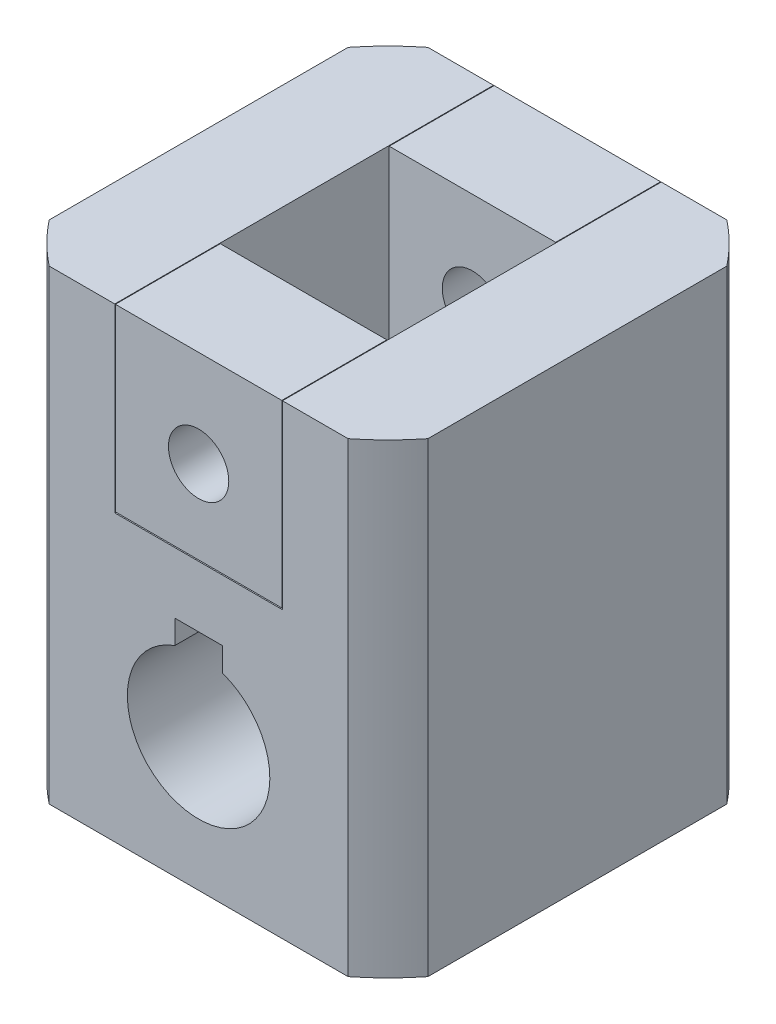
ISO-10303-21;
HEADER;
FILE_DESCRIPTION(('STEP AP214'),'2;1');
FILE_NAME('part.step','',(''),(''),'','','');
FILE_SCHEMA(('AUTOMOTIVE_DESIGN { 1 0 10303 214 1 1 1 1 }'));
ENDSEC;
DATA;
#1=APPLICATION_CONTEXT('core data for automotive mechanical design processes');
#2=APPLICATION_PROTOCOL_DEFINITION('international standard','automotive_design',2000,#1);
#3=PRODUCT_CONTEXT('',#1,'mechanical');
#4=PRODUCT('Part','Part','',(#3));
#5=PRODUCT_RELATED_PRODUCT_CATEGORY('part','',(#4));
#6=PRODUCT_DEFINITION_FORMATION('','',#4);
#7=PRODUCT_DEFINITION_CONTEXT('part definition',#1,'design');
#8=PRODUCT_DEFINITION('design','',#6,#7);
#9=PRODUCT_DEFINITION_SHAPE('','',#8);
#10=(LENGTH_UNIT() NAMED_UNIT(*) SI_UNIT(.MILLI.,.METRE.));
#11=(NAMED_UNIT(*) PLANE_ANGLE_UNIT() SI_UNIT($,.RADIAN.));
#12=(NAMED_UNIT(*) SI_UNIT($,.STERADIAN.) SOLID_ANGLE_UNIT());
#13=UNCERTAINTY_MEASURE_WITH_UNIT(LENGTH_MEASURE(1.E-05),#10,'distance_accuracy_value','');
#14=(GEOMETRIC_REPRESENTATION_CONTEXT(3) GLOBAL_UNCERTAINTY_ASSIGNED_CONTEXT((#13)) GLOBAL_UNIT_ASSIGNED_CONTEXT((#10,
#11,#12)) REPRESENTATION_CONTEXT('',''));
#15=CARTESIAN_POINT('',(0.,0.,0.));
#16=DIRECTION('',(0.,0.,1.));
#17=DIRECTION('',(1.,0.,0.));
#18=AXIS2_PLACEMENT_3D('',#15,#16,#17);
#19=CARTESIAN_POINT('',(0.,30.127,0.));
#20=DIRECTION('',(0.,-1.,0.));
#21=DIRECTION('',(0.,0.,-1.));
#22=AXIS2_PLACEMENT_3D('',#19,#20,#21);
#23=PLANE('',#22);
#24=DIRECTION('',(0.,0.,-1.));
#25=VECTOR('',#24,1.);
#26=CARTESIAN_POINT('',(8.76300000000005,30.127,-19.9389999999999));
#27=LINE('',#26,#25);
#28=CARTESIAN_POINT('',(8.76300000000005,30.127,-8.89000000000006));
#29=VERTEX_POINT('',#28);
#30=CARTESIAN_POINT('',(8.76300000000005,30.127,-19.9389999999999));
#31=VERTEX_POINT('',#30);
#32=EDGE_CURVE('E79',#29,#31,#27,.T.);
#33=ORIENTED_EDGE('',*,*,#32,.F.);
#34=DIRECTION('',(1.,0.,0.));
#35=VECTOR('',#34,1.);
#36=CARTESIAN_POINT('',(8.76300000000005,30.127,-8.89000000000006));
#37=LINE('',#36,#35);
#38=CARTESIAN_POINT('',(-8.76299999999997,30.127,-8.89000000000001));
#39=VERTEX_POINT('',#38);
#40=EDGE_CURVE('E104',#39,#29,#37,.T.);
#41=ORIENTED_EDGE('',*,*,#40,.F.);
#42=DIRECTION('',(0.,0.,1.));
#43=VECTOR('',#42,1.);
#44=CARTESIAN_POINT('',(-8.76299999999997,30.127,-8.89000000000001));
#45=LINE('',#44,#43);
#46=CARTESIAN_POINT('',(-8.76299999999988,30.127,-19.9390000000001));
#47=VERTEX_POINT('',#46);
#48=EDGE_CURVE('E134',#47,#39,#45,.T.);
#49=ORIENTED_EDGE('',*,*,#48,.F.);
#50=DIRECTION('',(-1.,0.,0.));
#51=VECTOR('',#50,1.);
#52=CARTESIAN_POINT('',(-8.76299999999988,30.127,-19.9390000000001));
#53=LINE('',#52,#51);
#54=EDGE_CURVE('E118',#31,#47,#53,.T.);
#55=ORIENTED_EDGE('',*,*,#54,.F.);
#56=EDGE_LOOP('',(#33,#41,#49,#55));
#57=FACE_BOUND('',#56,.T.);
#58=ADVANCED_FACE('F59',(#57),#23,.T.);
#59=CARTESIAN_POINT('',(0.,49.05,0.));
#60=DIRECTION('',(0.,-1.,0.));
#61=DIRECTION('',(0.,0.,-1.));
#62=AXIS2_PLACEMENT_3D('',#59,#60,#61);
#63=PLANE('',#62);
#64=DIRECTION('',(0.,0.,-1.));
#65=VECTOR('',#64,1.);
#66=CARTESIAN_POINT('',(8.76299999999997,49.05,-19.939));
#67=LINE('',#66,#65);
#68=CARTESIAN_POINT('',(8.76299999999994,49.05,-8.89000000000001));
#69=VERTEX_POINT('',#68);
#70=CARTESIAN_POINT('',(8.76299999999997,49.05,-19.939));
#71=VERTEX_POINT('',#70);
#72=EDGE_CURVE('E13',#69,#71,#67,.T.);
#73=ORIENTED_EDGE('',*,*,#72,.T.);
#74=DIRECTION('',(-1.,0.,0.));
#75=VECTOR('',#74,1.);
#76=CARTESIAN_POINT('',(-8.76299999999988,49.05,-19.9389999999999));
#77=LINE('',#76,#75);
#78=CARTESIAN_POINT('',(-8.76299999999988,49.05,-19.9389999999999));
#79=VERTEX_POINT('',#78);
#80=EDGE_CURVE('E70',#71,#79,#77,.T.);
#81=ORIENTED_EDGE('',*,*,#80,.T.);
#82=DIRECTION('',(0.,0.,1.));
#83=VECTOR('',#82,1.);
#84=CARTESIAN_POINT('',(-8.76299999999991,49.0500000000001,-8.89000000000004));
#85=LINE('',#84,#83);
#86=CARTESIAN_POINT('',(-8.76299999999991,49.0500000000001,-8.89000000000004));
#87=VERTEX_POINT('',#86);
#88=EDGE_CURVE('E116',#79,#87,#85,.T.);
#89=ORIENTED_EDGE('',*,*,#88,.T.);
#90=DIRECTION('',(1.,0.,0.));
#91=VECTOR('',#90,1.);
#92=CARTESIAN_POINT('',(8.76299999999994,49.05,-8.89000000000001));
#93=LINE('',#92,#91);
#94=EDGE_CURVE('E103',#87,#69,#93,.T.);
#95=ORIENTED_EDGE('',*,*,#94,.T.);
#96=EDGE_LOOP('',(#73,#81,#89,#95));
#97=FACE_BOUND('',#96,.T.);
#98=ADVANCED_FACE('F61',(#97),#63,.F.);
#99=CARTESIAN_POINT('',(-8.76299999999991,9.28186598653247,-19.9390000000001));
#100=DIRECTION('',(0.,0.,-1.));
#101=DIRECTION('',(0.,1.,0.));
#102=AXIS2_PLACEMENT_3D('',#99,#100,#101);
#103=PLANE('',#102);
#104=CARTESIAN_POINT('',(0.,38.89,-19.939));
#105=DIRECTION('',(0.,0.,1.));
#106=DIRECTION('',(1.,0.,0.));
#107=AXIS2_PLACEMENT_3D('',#104,#105,#106);
#108=CIRCLE('',#107,3.175);
#109=CARTESIAN_POINT('',(3.17500000000008,38.89,-19.939));
#110=VERTEX_POINT('',#109);
#111=EDGE_CURVE('E144',#110,#110,#108,.T.);
#112=ORIENTED_EDGE('',*,*,#111,.T.);
#113=EDGE_LOOP('',(#112));
#114=FACE_BOUND('',#113,.T.);
#115=DIRECTION('',(0.,1.,0.));
#116=VECTOR('',#115,1.);
#117=CARTESIAN_POINT('',(8.76299999999999,9.28186598653247,-19.9389999999999));
#118=LINE('',#117,#116);
#119=EDGE_CURVE('E110',#31,#71,#118,.T.);
#120=ORIENTED_EDGE('',*,*,#119,.F.);
#121=ORIENTED_EDGE('',*,*,#54,.T.);
#122=DIRECTION('',(0.,1.,0.));
#123=VECTOR('',#122,1.);
#124=CARTESIAN_POINT('',(-8.76299999999991,9.28186598653247,-19.9390000000001));
#125=LINE('',#124,#123);
#126=EDGE_CURVE('E124',#47,#79,#125,.T.);
#127=ORIENTED_EDGE('',*,*,#126,.T.);
#128=ORIENTED_EDGE('',*,*,#80,.F.);
#129=EDGE_LOOP('',(#120,#121,#127,#128));
#130=FACE_BOUND('',#129,.T.);
#131=ADVANCED_FACE('F165',(#114,#130),#103,.T.);
#132=CARTESIAN_POINT('',(-8.76299999999997,9.28186598653258,-8.88999999999998));
#133=DIRECTION('',(-1.,0.,0.));
#134=DIRECTION('',(0.,0.,1.));
#135=AXIS2_PLACEMENT_3D('',#132,#133,#134);
#136=PLANE('',#135);
#137=ORIENTED_EDGE('',*,*,#126,.F.);
#138=ORIENTED_EDGE('',*,*,#48,.T.);
#139=DIRECTION('',(0.,1.,0.));
#140=VECTOR('',#139,1.);
#141=CARTESIAN_POINT('',(-8.76299999999997,9.28186598653258,-8.88999999999998));
#142=LINE('',#141,#140);
#143=EDGE_CURVE('E133',#39,#87,#142,.T.);
#144=ORIENTED_EDGE('',*,*,#143,.T.);
#145=ORIENTED_EDGE('',*,*,#88,.F.);
#146=EDGE_LOOP('',(#137,#138,#144,#145));
#147=FACE_BOUND('',#146,.T.);
#148=ADVANCED_FACE('F159',(#147),#136,.T.);
#149=CARTESIAN_POINT('',(8.76300000000005,9.28186598653247,-8.89000000000004));
#150=DIRECTION('',(0.,0.,1.));
#151=DIRECTION('',(0.,-1.,0.));
#152=AXIS2_PLACEMENT_3D('',#149,#150,#151);
#153=PLANE('',#152);
#154=CARTESIAN_POINT('',(0.,38.89,-8.89000000000004));
#155=DIRECTION('',(0.,0.,1.));
#156=DIRECTION('',(0.,-1.,0.));
#157=AXIS2_PLACEMENT_3D('',#154,#155,#156);
#158=CIRCLE('',#157,3.175);
#159=CARTESIAN_POINT('',(0.,35.715,-8.89000000000004));
#160=VERTEX_POINT('',#159);
#161=EDGE_CURVE('E63',#160,#160,#158,.T.);
#162=ORIENTED_EDGE('',*,*,#161,.F.);
#163=EDGE_LOOP('',(#162));
#164=FACE_BOUND('',#163,.T.);
#165=ORIENTED_EDGE('',*,*,#143,.F.);
#166=ORIENTED_EDGE('',*,*,#40,.T.);
#167=DIRECTION('',(0.,1.,0.));
#168=VECTOR('',#167,1.);
#169=CARTESIAN_POINT('',(8.76300000000005,9.28186598653247,-8.89000000000004));
#170=LINE('',#169,#168);
#171=EDGE_CURVE('E98',#29,#69,#170,.T.);
#172=ORIENTED_EDGE('',*,*,#171,.T.);
#173=ORIENTED_EDGE('',*,*,#94,.F.);
#174=EDGE_LOOP('',(#165,#166,#172,#173));
#175=FACE_BOUND('',#174,.T.);
#176=ADVANCED_FACE('F101',(#164,#175),#153,.T.);
#177=CARTESIAN_POINT('',(8.76299999999999,9.28186598653247,-19.9389999999999));
#178=DIRECTION('',(1.,0.,0.));
#179=DIRECTION('',(0.,0.,-1.));
#180=AXIS2_PLACEMENT_3D('',#177,#178,#179);
#181=PLANE('',#180);
#182=ORIENTED_EDGE('',*,*,#171,.F.);
#183=ORIENTED_EDGE('',*,*,#32,.T.);
#184=ORIENTED_EDGE('',*,*,#119,.T.);
#185=ORIENTED_EDGE('',*,*,#72,.F.);
#186=EDGE_LOOP('',(#182,#183,#184,#185));
#187=FACE_BOUND('',#186,.T.);
#188=ADVANCED_FACE('F108',(#187),#181,.T.);
#189=CARTESIAN_POINT('',(0.,38.89,-19.939));
#190=DIRECTION('',(0.,0.,1.));
#191=DIRECTION('',(1.,0.,0.));
#192=AXIS2_PLACEMENT_3D('',#189,#190,#191);
#193=CYLINDRICAL_SURFACE('',#192,3.175);
#194=ORIENTED_EDGE('',*,*,#161,.T.);
#195=EDGE_LOOP('',(#194));
#196=FACE_BOUND('',#195,.T.);
#197=ORIENTED_EDGE('',*,*,#111,.F.);
#198=EDGE_LOOP('',(#197));
#199=FACE_BOUND('',#198,.T.);
#200=ADVANCED_FACE('F155',(#196,#199),#193,.F.);
#201=CLOSED_SHELL('',(#58,#98,#131,#148,#176,#188,#200));
#202=MANIFOLD_SOLID_BREP('B2',#201);
#203=CARTESIAN_POINT('',(0.,30.127,0.));
#204=DIRECTION('',(0.,-1.,0.));
#205=DIRECTION('',(0.,0.,-1.));
#206=AXIS2_PLACEMENT_3D('',#203,#204,#205);
#207=PLANE('',#206);
#208=DIRECTION('',(0.,0.,1.));
#209=VECTOR('',#208,1.);
#210=CARTESIAN_POINT('',(-8.76299999999997,30.127,8.89000000000001));
#211=LINE('',#210,#209);
#212=CARTESIAN_POINT('',(-8.76299999999997,30.127,8.89000000000001));
#213=VERTEX_POINT('',#212);
#214=CARTESIAN_POINT('',(-8.76299999999988,30.127,19.939));
#215=VERTEX_POINT('',#214);
#216=EDGE_CURVE('E252',#213,#215,#211,.T.);
#217=ORIENTED_EDGE('',*,*,#216,.F.);
#218=DIRECTION('',(-1.,0.,0.));
#219=VECTOR('',#218,1.);
#220=CARTESIAN_POINT('',(8.76300000000002,30.127,8.88999999999995));
#221=LINE('',#220,#219);
#222=CARTESIAN_POINT('',(8.76300000000002,30.127,8.88999999999995));
#223=VERTEX_POINT('',#222);
#224=EDGE_CURVE('E275',#223,#213,#221,.T.);
#225=ORIENTED_EDGE('',*,*,#224,.F.);
#226=DIRECTION('',(0.,0.,-1.));
#227=VECTOR('',#226,1.);
#228=CARTESIAN_POINT('',(8.76300000000002,30.127,19.939));
#229=LINE('',#228,#227);
#230=CARTESIAN_POINT('',(8.76300000000002,30.127,19.939));
#231=VERTEX_POINT('',#230);
#232=EDGE_CURVE('E280',#231,#223,#229,.T.);
#233=ORIENTED_EDGE('',*,*,#232,.F.);
#234=DIRECTION('',(1.,0.,0.));
#235=VECTOR('',#234,1.);
#236=CARTESIAN_POINT('',(-8.76299999999988,30.127,19.939));
#237=LINE('',#236,#235);
#238=EDGE_CURVE('E295',#215,#231,#237,.T.);
#239=ORIENTED_EDGE('',*,*,#238,.F.);
#240=EDGE_LOOP('',(#217,#225,#233,#239));
#241=FACE_BOUND('',#240,.T.);
#242=ADVANCED_FACE('F242',(#241),#207,.T.);
#243=CARTESIAN_POINT('',(0.,49.05,0.));
#244=DIRECTION('',(0.,1.,0.));
#245=DIRECTION('',(0.,0.,1.));
#246=AXIS2_PLACEMENT_3D('',#243,#244,#245);
#247=PLANE('',#246);
#248=DIRECTION('',(0.,0.,1.));
#249=VECTOR('',#248,1.);
#250=CARTESIAN_POINT('',(-8.76299999999999,49.0500000000001,8.88999999999995));
#251=LINE('',#250,#249);
#252=CARTESIAN_POINT('',(-8.76299999999999,49.0500000000001,8.88999999999995));
#253=VERTEX_POINT('',#252);
#254=CARTESIAN_POINT('',(-8.76299999999999,49.05,19.939));
#255=VERTEX_POINT('',#254);
#256=EDGE_CURVE('E307',#253,#255,#251,.T.);
#257=ORIENTED_EDGE('',*,*,#256,.T.);
#258=DIRECTION('',(1.,0.,0.));
#259=VECTOR('',#258,1.);
#260=CARTESIAN_POINT('',(-8.76299999999999,49.05,19.939));
#261=LINE('',#260,#259);
#262=CARTESIAN_POINT('',(8.76300000000008,49.05,19.939));
#263=VERTEX_POINT('',#262);
#264=EDGE_CURVE('E293',#255,#263,#261,.T.);
#265=ORIENTED_EDGE('',*,*,#264,.T.);
#266=DIRECTION('',(0.,0.,-1.));
#267=VECTOR('',#266,1.);
#268=CARTESIAN_POINT('',(8.76300000000008,49.05,19.939));
#269=LINE('',#268,#267);
#270=CARTESIAN_POINT('',(8.76299999999999,49.0500000000001,8.88999999999998));
#271=VERTEX_POINT('',#270);
#272=EDGE_CURVE('E298',#263,#271,#269,.T.);
#273=ORIENTED_EDGE('',*,*,#272,.T.);
#274=DIRECTION('',(-1.,0.,0.));
#275=VECTOR('',#274,1.);
#276=CARTESIAN_POINT('',(8.76299999999999,49.0500000000001,8.88999999999998));
#277=LINE('',#276,#275);
#278=EDGE_CURVE('E304',#271,#253,#277,.T.);
#279=ORIENTED_EDGE('',*,*,#278,.T.);
#280=EDGE_LOOP('',(#257,#265,#273,#279));
#281=FACE_BOUND('',#280,.T.);
#282=ADVANCED_FACE('F306',(#281),#247,.T.);
#283=CARTESIAN_POINT('',(-8.76299999999997,9.28186598653258,19.939));
#284=DIRECTION('',(0.,0.,1.));
#285=DIRECTION('',(0.,-1.,0.));
#286=AXIS2_PLACEMENT_3D('',#283,#284,#285);
#287=PLANE('',#286);
#288=CARTESIAN_POINT('',(1.11022302462516E-13,38.89,19.939));
#289=DIRECTION('',(0.,0.,1.));
#290=DIRECTION('',(1.,0.,0.));
#291=AXIS2_PLACEMENT_3D('',#288,#289,#290);
#292=CIRCLE('',#291,3.175);
#293=CARTESIAN_POINT('',(3.17500000000011,38.89,19.939));
#294=VERTEX_POINT('',#293);
#295=EDGE_CURVE('E336',#294,#294,#292,.T.);
#296=ORIENTED_EDGE('',*,*,#295,.F.);
#297=EDGE_LOOP('',(#296));
#298=FACE_BOUND('',#297,.T.);
#299=DIRECTION('',(0.,1.,0.));
#300=VECTOR('',#299,1.);
#301=CARTESIAN_POINT('',(-8.76299999999997,9.28186598653258,19.939));
#302=LINE('',#301,#300);
#303=EDGE_CURVE('E57',#215,#255,#302,.T.);
#304=ORIENTED_EDGE('',*,*,#303,.F.);
#305=ORIENTED_EDGE('',*,*,#238,.T.);
#306=DIRECTION('',(0.,1.,0.));
#307=VECTOR('',#306,1.);
#308=CARTESIAN_POINT('',(8.7630000000001,9.28186598653252,19.939));
#309=LINE('',#308,#307);
#310=EDGE_CURVE('E290',#231,#263,#309,.T.);
#311=ORIENTED_EDGE('',*,*,#310,.T.);
#312=ORIENTED_EDGE('',*,*,#264,.F.);
#313=EDGE_LOOP('',(#304,#305,#311,#312));
#314=FACE_BOUND('',#313,.T.);
#315=ADVANCED_FACE('F291',(#298,#314),#287,.T.);
#316=CARTESIAN_POINT('',(8.7630000000001,9.28186598653252,19.939));
#317=DIRECTION('',(1.,0.,0.));
#318=DIRECTION('',(0.,0.,-1.));
#319=AXIS2_PLACEMENT_3D('',#316,#317,#318);
#320=PLANE('',#319);
#321=ORIENTED_EDGE('',*,*,#310,.F.);
#322=ORIENTED_EDGE('',*,*,#232,.T.);
#323=DIRECTION('',(0.,1.,0.));
#324=VECTOR('',#323,1.);
#325=CARTESIAN_POINT('',(8.76300000000005,9.28186598653263,8.88999999999995));
#326=LINE('',#325,#324);
#327=EDGE_CURVE('E285',#223,#271,#326,.T.);
#328=ORIENTED_EDGE('',*,*,#327,.T.);
#329=ORIENTED_EDGE('',*,*,#272,.F.);
#330=EDGE_LOOP('',(#321,#322,#328,#329));
#331=FACE_BOUND('',#330,.T.);
#332=ADVANCED_FACE('F299',(#331),#320,.T.);
#333=CARTESIAN_POINT('',(8.76300000000005,9.28186598653263,8.88999999999995));
#334=DIRECTION('',(0.,0.,-1.));
#335=DIRECTION('',(0.,1.,0.));
#336=AXIS2_PLACEMENT_3D('',#333,#334,#335);
#337=PLANE('',#336);
#338=CARTESIAN_POINT('',(0.,38.8900000000001,8.88999999999995));
#339=DIRECTION('',(0.,0.,-1.));
#340=DIRECTION('',(0.,1.,0.));
#341=AXIS2_PLACEMENT_3D('',#338,#339,#340);
#342=CIRCLE('',#341,3.175);
#343=CARTESIAN_POINT('',(0.,42.0650000000001,8.88999999999995));
#344=VERTEX_POINT('',#343);
#345=EDGE_CURVE('E245',#344,#344,#342,.T.);
#346=ORIENTED_EDGE('',*,*,#345,.F.);
#347=EDGE_LOOP('',(#346));
#348=FACE_BOUND('',#347,.T.);
#349=ORIENTED_EDGE('',*,*,#327,.F.);
#350=ORIENTED_EDGE('',*,*,#224,.T.);
#351=DIRECTION('',(0.,1.,0.));
#352=VECTOR('',#351,1.);
#353=CARTESIAN_POINT('',(-8.76299999999997,9.28186598653258,8.89000000000001));
#354=LINE('',#353,#352);
#355=EDGE_CURVE('E319',#213,#253,#354,.T.);
#356=ORIENTED_EDGE('',*,*,#355,.T.);
#357=ORIENTED_EDGE('',*,*,#278,.F.);
#358=EDGE_LOOP('',(#349,#350,#356,#357));
#359=FACE_BOUND('',#358,.T.);
#360=ADVANCED_FACE('F349',(#348,#359),#337,.T.);
#361=CARTESIAN_POINT('',(-8.76299999999997,9.28186598653258,8.89000000000001));
#362=DIRECTION('',(-1.,0.,0.));
#363=DIRECTION('',(0.,0.,1.));
#364=AXIS2_PLACEMENT_3D('',#361,#362,#363);
#365=PLANE('',#364);
#366=ORIENTED_EDGE('',*,*,#355,.F.);
#367=ORIENTED_EDGE('',*,*,#216,.T.);
#368=ORIENTED_EDGE('',*,*,#303,.T.);
#369=ORIENTED_EDGE('',*,*,#256,.F.);
#370=EDGE_LOOP('',(#366,#367,#368,#369));
#371=FACE_BOUND('',#370,.T.);
#372=ADVANCED_FACE('F352',(#371),#365,.T.);
#373=CARTESIAN_POINT('',(0.,38.89,-19.939));
#374=DIRECTION('',(0.,0.,1.));
#375=DIRECTION('',(1.,0.,0.));
#376=AXIS2_PLACEMENT_3D('',#373,#374,#375);
#377=CYLINDRICAL_SURFACE('',#376,3.175);
#378=ORIENTED_EDGE('',*,*,#345,.T.);
#379=EDGE_LOOP('',(#378));
#380=FACE_BOUND('',#379,.T.);
#381=ORIENTED_EDGE('',*,*,#295,.T.);
#382=EDGE_LOOP('',(#381));
#383=FACE_BOUND('',#382,.T.);
#384=ADVANCED_FACE('F347',(#380,#383),#377,.F.);
#385=CLOSED_SHELL('',(#242,#282,#315,#332,#360,#372,#384));
#386=MANIFOLD_SOLID_BREP('B7',#385);
#387=CARTESIAN_POINT('',(-19.939,49.0499999999999,-19.9390000000001));
#388=DIRECTION('',(0.,0.,1.));
#389=DIRECTION('',(1.,0.,0.));
#390=AXIS2_PLACEMENT_3D('',#387,#388,#389);
#391=PLANE('',#390);
#392=DIRECTION('',(0.,-1.,0.));
#393=VECTOR('',#392,1.);
#394=CARTESIAN_POINT('',(-2.49999999999995,21.0690678118655,-19.9390000000001));
#395=LINE('',#394,#393);
#396=CARTESIAN_POINT('',(-2.5,23.5690678118655,-19.939));
#397=VERTEX_POINT('',#396);
#398=CARTESIAN_POINT('',(-2.49999999999995,21.0690678118655,-19.9390000000001));
#399=VERTEX_POINT('',#398);
#400=EDGE_CURVE('E540',#397,#399,#395,.T.);
#401=ORIENTED_EDGE('',*,*,#400,.T.);
#402=CARTESIAN_POINT('',(1.11022302462516E-13,13.9980000000001,-19.9390000000001));
#403=DIRECTION('',(0.,0.,1.));
#404=DIRECTION('',(-1.,0.,0.));
#405=AXIS2_PLACEMENT_3D('',#402,#403,#404);
#406=CIRCLE('',#405,7.5);
#407=CARTESIAN_POINT('',(2.5,21.0690678118655,-19.939));
#408=VERTEX_POINT('',#407);
#409=EDGE_CURVE('E533',#399,#408,#406,.T.);
#410=ORIENTED_EDGE('',*,*,#409,.T.);
#411=DIRECTION('',(0.,1.,0.));
#412=VECTOR('',#411,1.);
#413=CARTESIAN_POINT('',(2.50000000000006,23.5690678118655,-19.939));
#414=LINE('',#413,#412);
#415=CARTESIAN_POINT('',(2.50000000000006,23.5690678118655,-19.939));
#416=VERTEX_POINT('',#415);
#417=EDGE_CURVE('E543',#408,#416,#414,.T.);
#418=ORIENTED_EDGE('',*,*,#417,.T.);
#419=DIRECTION('',(-1.,0.,0.));
#420=VECTOR('',#419,1.);
#421=CARTESIAN_POINT('',(-2.5,23.5690678118655,-19.939));
#422=LINE('',#421,#420);
#423=EDGE_CURVE('E433',#416,#397,#422,.T.);
#424=ORIENTED_EDGE('',*,*,#423,.T.);
#425=EDGE_LOOP('',(#401,#410,#418,#424));
#426=FACE_BOUND('',#425,.T.);
#427=DIRECTION('',(0.,1.,0.));
#428=VECTOR('',#427,1.);
#429=CARTESIAN_POINT('',(15.7351923725133,0.,-19.939));
#430=LINE('',#429,#428);
#431=CARTESIAN_POINT('',(15.7351923725133,0.,-19.939));
#432=VERTEX_POINT('',#431);
#433=CARTESIAN_POINT('',(15.7351923725134,49.0499999999999,-19.939));
#434=VERTEX_POINT('',#433);
#435=EDGE_CURVE('E613',#432,#434,#430,.T.);
#436=ORIENTED_EDGE('',*,*,#435,.F.);
#437=DIRECTION('',(-1.,0.,0.));
#438=VECTOR('',#437,1.);
#439=CARTESIAN_POINT('',(-19.939,0.,-19.9390000000001));
#440=LINE('',#439,#438);
#441=CARTESIAN_POINT('',(-15.7351923725132,0.,-19.939));
#442=VERTEX_POINT('',#441);
#443=EDGE_CURVE('E674',#432,#442,#440,.T.);
#444=ORIENTED_EDGE('',*,*,#443,.T.);
#445=DIRECTION('',(0.,1.,0.));
#446=VECTOR('',#445,1.);
#447=CARTESIAN_POINT('',(-15.7351923725132,0.,-19.939));
#448=LINE('',#447,#446);
#449=CARTESIAN_POINT('',(-15.7351923725133,49.05,-19.9390000000001));
#450=VERTEX_POINT('',#449);
#451=EDGE_CURVE('E610',#450,#442,#448,.F.);
#452=ORIENTED_EDGE('',*,*,#451,.F.);
#453=DIRECTION('',(-1.,0.,0.));
#454=VECTOR('',#453,1.);
#455=CARTESIAN_POINT('',(-19.939,49.0499999999999,-19.9390000000001));
#456=LINE('',#455,#454);
#457=CARTESIAN_POINT('',(-8.82649999999993,49.05,-19.9389999999999));
#458=VERTEX_POINT('',#457);
#459=EDGE_CURVE('E658',#458,#450,#456,.T.);
#460=ORIENTED_EDGE('',*,*,#459,.F.);
#461=DIRECTION('',(0.,1.,0.));
#462=VECTOR('',#461,1.);
#463=CARTESIAN_POINT('',(-8.82650000000004,30.,-19.9390000000001));
#464=LINE('',#463,#462);
#465=CARTESIAN_POINT('',(-8.82650000000004,30.,-19.9390000000001));
#466=VERTEX_POINT('',#465);
#467=EDGE_CURVE('E643',#466,#458,#464,.T.);
#468=ORIENTED_EDGE('',*,*,#467,.F.);
#469=DIRECTION('',(1.,0.,0.));
#470=VECTOR('',#469,1.);
#471=CARTESIAN_POINT('',(-8.82650000000004,30.,-19.9390000000001));
#472=LINE('',#471,#470);
#473=CARTESIAN_POINT('',(8.82650000000002,30.,-19.9389999999999));
#474=VERTEX_POINT('',#473);
#475=EDGE_CURVE('E629',#466,#474,#472,.T.);
#476=ORIENTED_EDGE('',*,*,#475,.T.);
#477=DIRECTION('',(0.,1.,0.));
#478=VECTOR('',#477,1.);
#479=CARTESIAN_POINT('',(8.82650000000002,30.,-19.9389999999999));
#480=LINE('',#479,#478);
#481=CARTESIAN_POINT('',(8.82649999999999,49.05,-19.939));
#482=VERTEX_POINT('',#481);
#483=EDGE_CURVE('E633',#474,#482,#480,.T.);
#484=ORIENTED_EDGE('',*,*,#483,.T.);
#485=EDGE_CURVE('E660',#434,#482,#456,.T.);
#486=ORIENTED_EDGE('',*,*,#485,.F.);
#487=EDGE_LOOP('',(#436,#444,#452,#460,#468,#476,#484,#486));
#488=FACE_BOUND('',#487,.T.);
#489=ADVANCED_FACE('F416',(#426,#488),#391,.F.);
#490=CARTESIAN_POINT('',(-19.939,49.0500000000001,19.939));
#491=DIRECTION('',(0.,0.,-1.));
#492=DIRECTION('',(-1.,0.,0.));
#493=AXIS2_PLACEMENT_3D('',#490,#491,#492);
#494=PLANE('',#493);
#495=DIRECTION('',(0.,1.,0.));
#496=VECTOR('',#495,1.);
#497=CARTESIAN_POINT('',(2.50000000000006,23.5690678118655,19.939));
#498=LINE('',#497,#496);
#499=CARTESIAN_POINT('',(2.50000000000006,21.0690678118656,19.939));
#500=VERTEX_POINT('',#499);
#501=CARTESIAN_POINT('',(2.50000000000006,23.5690678118655,19.939));
#502=VERTEX_POINT('',#501);
#503=EDGE_CURVE('E568',#500,#502,#498,.T.);
#504=ORIENTED_EDGE('',*,*,#503,.F.);
#505=CARTESIAN_POINT('',(0.,13.9980000000001,19.939));
#506=DIRECTION('',(0.,0.,1.));
#507=DIRECTION('',(-1.,0.,0.));
#508=AXIS2_PLACEMENT_3D('',#505,#506,#507);
#509=CIRCLE('',#508,7.5);
#510=CARTESIAN_POINT('',(-2.5,21.0690678118655,19.939));
#511=VERTEX_POINT('',#510);
#512=EDGE_CURVE('E441',#511,#500,#509,.T.);
#513=ORIENTED_EDGE('',*,*,#512,.F.);
#514=DIRECTION('',(0.,-1.,0.));
#515=VECTOR('',#514,1.);
#516=CARTESIAN_POINT('',(-2.5,21.0690678118655,19.939));
#517=LINE('',#516,#515);
#518=CARTESIAN_POINT('',(-2.50000000000003,23.5690678118655,19.939));
#519=VERTEX_POINT('',#518);
#520=EDGE_CURVE('E551',#519,#511,#517,.T.);
#521=ORIENTED_EDGE('',*,*,#520,.F.);
#522=DIRECTION('',(-1.,0.,0.));
#523=VECTOR('',#522,1.);
#524=CARTESIAN_POINT('',(-2.50000000000003,23.5690678118655,19.939));
#525=LINE('',#524,#523);
#526=EDGE_CURVE('E556',#502,#519,#525,.T.);
#527=ORIENTED_EDGE('',*,*,#526,.F.);
#528=EDGE_LOOP('',(#504,#513,#521,#527));
#529=FACE_BOUND('',#528,.T.);
#530=DIRECTION('',(0.,1.,0.));
#531=VECTOR('',#530,1.);
#532=CARTESIAN_POINT('',(-15.7351923725133,1.11022302462516E-13,19.939));
#533=LINE('',#532,#531);
#534=CARTESIAN_POINT('',(-15.7351923725133,1.11022302462516E-13,19.939));
#535=VERTEX_POINT('',#534);
#536=CARTESIAN_POINT('',(-15.7351923725133,49.05,19.939));
#537=VERTEX_POINT('',#536);
#538=EDGE_CURVE('E607',#535,#537,#533,.T.);
#539=ORIENTED_EDGE('',*,*,#538,.F.);
#540=DIRECTION('',(1.,0.,0.));
#541=VECTOR('',#540,1.);
#542=CARTESIAN_POINT('',(-19.9389999999999,0.,19.939));
#543=LINE('',#542,#541);
#544=CARTESIAN_POINT('',(15.7351923725133,0.,19.939));
#545=VERTEX_POINT('',#544);
#546=EDGE_CURVE('E659',#535,#545,#543,.T.);
#547=ORIENTED_EDGE('',*,*,#546,.T.);
#548=DIRECTION('',(0.,1.,0.));
#549=VECTOR('',#548,1.);
#550=CARTESIAN_POINT('',(15.7351923725133,0.,19.939));
#551=LINE('',#550,#549);
#552=CARTESIAN_POINT('',(15.7351923725134,49.05,19.939));
#553=VERTEX_POINT('',#552);
#554=EDGE_CURVE('E604',#553,#545,#551,.F.);
#555=ORIENTED_EDGE('',*,*,#554,.F.);
#556=DIRECTION('',(1.,0.,0.));
#557=VECTOR('',#556,1.);
#558=CARTESIAN_POINT('',(-19.939,49.0500000000001,19.939));
#559=LINE('',#558,#557);
#560=CARTESIAN_POINT('',(8.82649999999999,49.05,19.939));
#561=VERTEX_POINT('',#560);
#562=EDGE_CURVE('E667',#561,#553,#559,.T.);
#563=ORIENTED_EDGE('',*,*,#562,.F.);
#564=DIRECTION('',(0.,1.,0.));
#565=VECTOR('',#564,1.);
#566=CARTESIAN_POINT('',(8.82650000000007,30.0000000000001,19.939));
#567=LINE('',#566,#565);
#568=CARTESIAN_POINT('',(8.82650000000007,30.0000000000001,19.939));
#569=VERTEX_POINT('',#568);
#570=EDGE_CURVE('E650',#569,#561,#567,.T.);
#571=ORIENTED_EDGE('',*,*,#570,.F.);
#572=DIRECTION('',(-1.,0.,0.));
#573=VECTOR('',#572,1.);
#574=CARTESIAN_POINT('',(-8.82650000000004,30.,19.939));
#575=LINE('',#574,#573);
#576=CARTESIAN_POINT('',(-8.82650000000004,30.,19.939));
#577=VERTEX_POINT('',#576);
#578=EDGE_CURVE('E621',#569,#577,#575,.T.);
#579=ORIENTED_EDGE('',*,*,#578,.T.);
#580=DIRECTION('',(0.,1.,0.));
#581=VECTOR('',#580,1.);
#582=CARTESIAN_POINT('',(-8.82650000000004,30.,19.939));
#583=LINE('',#582,#581);
#584=CARTESIAN_POINT('',(-8.82649999999996,49.05,19.939));
#585=VERTEX_POINT('',#584);
#586=EDGE_CURVE('E646',#577,#585,#583,.T.);
#587=ORIENTED_EDGE('',*,*,#586,.T.);
#588=EDGE_CURVE('E668',#537,#585,#559,.T.);
#589=ORIENTED_EDGE('',*,*,#588,.F.);
#590=EDGE_LOOP('',(#539,#547,#555,#563,#571,#579,#587,#589));
#591=FACE_BOUND('',#590,.T.);
#592=ADVANCED_FACE('F688',(#529,#591),#494,.F.);
#593=CARTESIAN_POINT('',(0.,49.05,0.));
#594=DIRECTION('',(0.,-1.,0.));
#595=DIRECTION('',(0.,0.,-1.));
#596=AXIS2_PLACEMENT_3D('',#593,#594,#595);
#597=PLANE('',#596);
#598=CARTESIAN_POINT('',(0.,49.05,0.));
#599=DIRECTION('',(0.,1.,0.));
#600=DIRECTION('',(0.,0.,1.));
#601=AXIS2_PLACEMENT_3D('',#598,#599,#600);
#602=CIRCLE('',#601,25.4);
#603=CARTESIAN_POINT('',(19.939,49.0500000000001,-15.7351923725133));
#604=VERTEX_POINT('',#603);
#605=EDGE_CURVE('E592',#604,#434,#602,.T.);
#606=ORIENTED_EDGE('',*,*,#605,.T.);
#607=ORIENTED_EDGE('',*,*,#485,.T.);
#608=DIRECTION('',(0.,0.,1.));
#609=VECTOR('',#608,1.);
#610=CARTESIAN_POINT('',(8.82649999999999,49.05,19.939));
#611=LINE('',#610,#609);
#612=EDGE_CURVE('E616',#482,#561,#611,.T.);
#613=ORIENTED_EDGE('',*,*,#612,.T.);
#614=ORIENTED_EDGE('',*,*,#562,.T.);
#615=CARTESIAN_POINT('',(19.939,49.0500000000001,15.7351923725132));
#616=VERTEX_POINT('',#615);
#617=EDGE_CURVE('E588',#553,#616,#602,.T.);
#618=ORIENTED_EDGE('',*,*,#617,.T.);
#619=DIRECTION('',(0.,0.,-1.));
#620=VECTOR('',#619,1.);
#621=CARTESIAN_POINT('',(19.9390000000001,49.05,19.939));
#622=LINE('',#621,#620);
#623=EDGE_CURVE('E654',#616,#604,#622,.T.);
#624=ORIENTED_EDGE('',*,*,#623,.T.);
#625=EDGE_LOOP('',(#606,#607,#613,#614,#618,#624));
#626=FACE_BOUND('',#625,.T.);
#627=ADVANCED_FACE('F707',(#626),#597,.F.);
#628=CARTESIAN_POINT('',(-19.939,49.0500000000001,15.7351923725133));
#629=VERTEX_POINT('',#628);
#630=EDGE_CURVE('E578',#629,#537,#602,.T.);
#631=ORIENTED_EDGE('',*,*,#630,.T.);
#632=ORIENTED_EDGE('',*,*,#588,.T.);
#633=DIRECTION('',(0.,0.,-1.));
#634=VECTOR('',#633,1.);
#635=CARTESIAN_POINT('',(-8.82649999999996,49.05,19.939));
#636=LINE('',#635,#634);
#637=EDGE_CURVE('E622',#585,#458,#636,.T.);
#638=ORIENTED_EDGE('',*,*,#637,.T.);
#639=ORIENTED_EDGE('',*,*,#459,.T.);
#640=CARTESIAN_POINT('',(-19.9390000000001,49.05,-15.7351923725134));
#641=VERTEX_POINT('',#640);
#642=EDGE_CURVE('E726',#450,#641,#602,.T.);
#643=ORIENTED_EDGE('',*,*,#642,.T.);
#644=DIRECTION('',(0.,0.,1.));
#645=VECTOR('',#644,1.);
#646=CARTESIAN_POINT('',(-19.939,49.0500000000001,19.939));
#647=LINE('',#646,#645);
#648=EDGE_CURVE('E663',#641,#629,#647,.T.);
#649=ORIENTED_EDGE('',*,*,#648,.T.);
#650=EDGE_LOOP('',(#631,#632,#638,#639,#643,#649));
#651=FACE_BOUND('',#650,.T.);
#652=ADVANCED_FACE('F725',(#651),#597,.F.);
#653=CARTESIAN_POINT('',(19.9390000000001,49.05,19.939));
#654=DIRECTION('',(-1.,0.,0.));
#655=DIRECTION('',(0.,0.,1.));
#656=AXIS2_PLACEMENT_3D('',#653,#654,#655);
#657=PLANE('',#656);
#658=DIRECTION('',(0.,1.,0.));
#659=VECTOR('',#658,1.);
#660=CARTESIAN_POINT('',(19.939,1.11022302462516E-13,15.7351923725132));
#661=LINE('',#660,#659);
#662=CARTESIAN_POINT('',(19.939,1.11022302462516E-13,15.7351923725132));
#663=VERTEX_POINT('',#662);
#664=EDGE_CURVE('E601',#663,#616,#661,.T.);
#665=ORIENTED_EDGE('',*,*,#664,.F.);
#666=DIRECTION('',(0.,0.,-1.));
#667=VECTOR('',#666,1.);
#668=CARTESIAN_POINT('',(19.939,1.11022302462516E-13,19.939));
#669=LINE('',#668,#667);
#670=CARTESIAN_POINT('',(19.9390000000001,0.,-15.7351923725133));
#671=VERTEX_POINT('',#670);
#672=EDGE_CURVE('E653',#663,#671,#669,.T.);
#673=ORIENTED_EDGE('',*,*,#672,.T.);
#674=DIRECTION('',(0.,1.,0.));
#675=VECTOR('',#674,1.);
#676=CARTESIAN_POINT('',(19.9390000000001,0.,-15.7351923725133));
#677=LINE('',#676,#675);
#678=EDGE_CURVE('E598',#604,#671,#677,.F.);
#679=ORIENTED_EDGE('',*,*,#678,.F.);
#680=ORIENTED_EDGE('',*,*,#623,.F.);
#681=EDGE_LOOP('',(#665,#673,#679,#680));
#682=FACE_BOUND('',#681,.T.);
#683=ADVANCED_FACE('F418',(#682),#657,.F.);
#684=CARTESIAN_POINT('',(-19.939,49.0500000000001,19.939));
#685=DIRECTION('',(1.,0.,0.));
#686=DIRECTION('',(0.,0.,-1.));
#687=AXIS2_PLACEMENT_3D('',#684,#685,#686);
#688=PLANE('',#687);
#689=CARTESIAN_POINT('',(-19.939,42.7000000000001,0.));
#690=DIRECTION('',(1.,0.,0.));
#691=DIRECTION('',(0.,0.,-1.));
#692=AXIS2_PLACEMENT_3D('',#689,#690,#691);
#693=CIRCLE('',#692,2.1);
#694=CARTESIAN_POINT('',(-19.939,42.7000000000001,-2.1));
#695=VERTEX_POINT('',#694);
#696=EDGE_CURVE('E943',#695,#695,#693,.T.);
#697=ORIENTED_EDGE('',*,*,#696,.T.);
#698=EDGE_LOOP('',(#697));
#699=FACE_BOUND('',#698,.T.);
#700=CARTESIAN_POINT('',(-19.939,30.0000000000001,0.));
#701=DIRECTION('',(1.,0.,0.));
#702=DIRECTION('',(0.,0.,-1.));
#703=AXIS2_PLACEMENT_3D('',#700,#701,#702);
#704=CIRCLE('',#703,2.1);
#705=CARTESIAN_POINT('',(-19.939,30.0000000000001,-2.1));
#706=VERTEX_POINT('',#705);
#707=EDGE_CURVE('E559',#706,#706,#704,.T.);
#708=ORIENTED_EDGE('',*,*,#707,.T.);
#709=EDGE_LOOP('',(#708));
#710=FACE_BOUND('',#709,.T.);
#711=DIRECTION('',(0.,1.,0.));
#712=VECTOR('',#711,1.);
#713=CARTESIAN_POINT('',(-19.939,1.11022302462516E-13,-15.7351923725134));
#714=LINE('',#713,#712);
#715=CARTESIAN_POINT('',(-19.939,1.11022302462516E-13,-15.7351923725134));
#716=VERTEX_POINT('',#715);
#717=EDGE_CURVE('E595',#716,#641,#714,.T.);
#718=ORIENTED_EDGE('',*,*,#717,.F.);
#719=DIRECTION('',(0.,0.,1.));
#720=VECTOR('',#719,1.);
#721=CARTESIAN_POINT('',(-19.9389999999999,0.,19.939));
#722=LINE('',#721,#720);
#723=CARTESIAN_POINT('',(-19.939,1.11022302462516E-13,15.7351923725133));
#724=VERTEX_POINT('',#723);
#725=EDGE_CURVE('E678',#716,#724,#722,.T.);
#726=ORIENTED_EDGE('',*,*,#725,.T.);
#727=DIRECTION('',(0.,1.,0.));
#728=VECTOR('',#727,1.);
#729=CARTESIAN_POINT('',(-19.939,1.11022302462516E-13,15.7351923725133));
#730=LINE('',#729,#728);
#731=EDGE_CURVE('E587',#629,#724,#730,.F.);
#732=ORIENTED_EDGE('',*,*,#731,.F.);
#733=ORIENTED_EDGE('',*,*,#648,.F.);
#734=EDGE_LOOP('',(#718,#726,#732,#733));
#735=FACE_BOUND('',#734,.T.);
#736=ADVANCED_FACE('F742',(#699,#710,#735),#688,.F.);
#737=CARTESIAN_POINT('',(0.,0.,0.));
#738=DIRECTION('',(0.,-1.,0.));
#739=DIRECTION('',(0.,0.,-1.));
#740=AXIS2_PLACEMENT_3D('',#737,#738,#739);
#741=PLANE('',#740);
#742=ORIENTED_EDGE('',*,*,#443,.F.);
#743=CARTESIAN_POINT('',(0.,0.,0.));
#744=DIRECTION('',(0.,-1.,0.));
#745=DIRECTION('',(0.,0.,-1.));
#746=AXIS2_PLACEMENT_3D('',#743,#744,#745);
#747=CIRCLE('',#746,25.4);
#748=EDGE_CURVE('E240',#432,#671,#747,.T.);
#749=ORIENTED_EDGE('',*,*,#748,.T.);
#750=ORIENTED_EDGE('',*,*,#672,.F.);
#751=CARTESIAN_POINT('',(0.,0.,0.));
#752=DIRECTION('',(0.,1.,0.));
#753=DIRECTION('',(0.,0.,1.));
#754=AXIS2_PLACEMENT_3D('',#751,#752,#753);
#755=CIRCLE('',#754,25.4);
#756=EDGE_CURVE('E584',#545,#663,#755,.T.);
#757=ORIENTED_EDGE('',*,*,#756,.F.);
#758=ORIENTED_EDGE('',*,*,#546,.F.);
#759=EDGE_CURVE('E426',#535,#724,#747,.T.);
#760=ORIENTED_EDGE('',*,*,#759,.T.);
#761=ORIENTED_EDGE('',*,*,#725,.F.);
#762=EDGE_CURVE('E420',#716,#442,#747,.T.);
#763=ORIENTED_EDGE('',*,*,#762,.T.);
#764=EDGE_LOOP('',(#742,#749,#750,#757,#758,#760,#761,#763));
#765=FACE_BOUND('',#764,.T.);
#766=ADVANCED_FACE('F696',(#765),#741,.T.);
#767=CARTESIAN_POINT('',(8.82650000000007,30.0000000000001,19.939));
#768=DIRECTION('',(-1.,0.,0.));
#769=DIRECTION('',(0.,0.,1.));
#770=AXIS2_PLACEMENT_3D('',#767,#768,#769);
#771=PLANE('',#770);
#772=ORIENTED_EDGE('',*,*,#612,.F.);
#773=ORIENTED_EDGE('',*,*,#483,.F.);
#774=DIRECTION('',(0.,0.,1.));
#775=VECTOR('',#774,1.);
#776=CARTESIAN_POINT('',(8.82650000000007,30.0000000000001,19.939));
#777=LINE('',#776,#775);
#778=EDGE_CURVE('E617',#474,#569,#777,.T.);
#779=ORIENTED_EDGE('',*,*,#778,.T.);
#780=ORIENTED_EDGE('',*,*,#570,.T.);
#781=EDGE_LOOP('',(#772,#773,#779,#780));
#782=FACE_BOUND('',#781,.T.);
#783=ADVANCED_FACE('F753',(#782),#771,.T.);
#784=CARTESIAN_POINT('',(-8.82650000000004,30.,19.939));
#785=DIRECTION('',(1.,0.,0.));
#786=DIRECTION('',(0.,0.,-1.));
#787=AXIS2_PLACEMENT_3D('',#784,#785,#786);
#788=PLANE('',#787);
#789=ORIENTED_EDGE('',*,*,#637,.F.);
#790=ORIENTED_EDGE('',*,*,#586,.F.);
#791=DIRECTION('',(0.,0.,-1.));
#792=VECTOR('',#791,1.);
#793=CARTESIAN_POINT('',(-8.82650000000004,30.,19.939));
#794=LINE('',#793,#792);
#795=EDGE_CURVE('E626',#577,#466,#794,.T.);
#796=ORIENTED_EDGE('',*,*,#795,.T.);
#797=ORIENTED_EDGE('',*,*,#467,.T.);
#798=EDGE_LOOP('',(#789,#790,#796,#797));
#799=FACE_BOUND('',#798,.T.);
#800=ADVANCED_FACE('F747',(#799),#788,.T.);
#801=CARTESIAN_POINT('',(0.,30.,0.));
#802=DIRECTION('',(0.,-1.,0.));
#803=DIRECTION('',(0.,0.,-1.));
#804=AXIS2_PLACEMENT_3D('',#801,#802,#803);
#805=PLANE('',#804);
#806=ORIENTED_EDGE('',*,*,#778,.F.);
#807=ORIENTED_EDGE('',*,*,#475,.F.);
#808=ORIENTED_EDGE('',*,*,#795,.F.);
#809=ORIENTED_EDGE('',*,*,#578,.F.);
#810=EDGE_LOOP('',(#806,#807,#808,#809));
#811=FACE_BOUND('',#810,.T.);
#812=ADVANCED_FACE('F751',(#811),#805,.F.);
#813=CARTESIAN_POINT('',(0.,0.,0.));
#814=DIRECTION('',(0.,1.,0.));
#815=DIRECTION('',(0.,0.,1.));
#816=AXIS2_PLACEMENT_3D('',#813,#814,#815);
#817=CYLINDRICAL_SURFACE('',#816,25.4);
#818=ORIENTED_EDGE('',*,*,#451,.T.);
#819=ORIENTED_EDGE('',*,*,#762,.F.);
#820=ORIENTED_EDGE('',*,*,#717,.T.);
#821=ORIENTED_EDGE('',*,*,#642,.F.);
#822=EDGE_LOOP('',(#818,#819,#820,#821));
#823=FACE_BOUND('',#822,.T.);
#824=ADVANCED_FACE('F734',(#823),#817,.T.);
#825=ORIENTED_EDGE('',*,*,#538,.T.);
#826=ORIENTED_EDGE('',*,*,#630,.F.);
#827=ORIENTED_EDGE('',*,*,#731,.T.);
#828=ORIENTED_EDGE('',*,*,#759,.F.);
#829=EDGE_LOOP('',(#825,#826,#827,#828));
#830=FACE_BOUND('',#829,.T.);
#831=ADVANCED_FACE('F818',(#830),#817,.T.);
#832=ORIENTED_EDGE('',*,*,#554,.T.);
#833=ORIENTED_EDGE('',*,*,#756,.T.);
#834=ORIENTED_EDGE('',*,*,#664,.T.);
#835=ORIENTED_EDGE('',*,*,#617,.F.);
#836=EDGE_LOOP('',(#832,#833,#834,#835));
#837=FACE_BOUND('',#836,.T.);
#838=ADVANCED_FACE('F701',(#837),#817,.T.);
#839=ORIENTED_EDGE('',*,*,#435,.T.);
#840=ORIENTED_EDGE('',*,*,#605,.F.);
#841=ORIENTED_EDGE('',*,*,#678,.T.);
#842=ORIENTED_EDGE('',*,*,#748,.F.);
#843=EDGE_LOOP('',(#839,#840,#841,#842));
#844=FACE_BOUND('',#843,.T.);
#845=ADVANCED_FACE('F820',(#844),#817,.T.);
#846=CARTESIAN_POINT('',(1.11022302462516E-13,13.9980000000001,-19.9390000000001));
#847=DIRECTION('',(0.,0.,1.));
#848=DIRECTION('',(1.,0.,0.));
#849=AXIS2_PLACEMENT_3D('',#846,#847,#848);
#850=CYLINDRICAL_SURFACE('',#849,7.5);
#851=ORIENTED_EDGE('',*,*,#512,.T.);
#852=DIRECTION('',(0.,0.,1.));
#853=VECTOR('',#852,1.);
#854=CARTESIAN_POINT('',(2.5,21.0690678118655,-19.939));
#855=LINE('',#854,#853);
#856=EDGE_CURVE('E529',#408,#500,#855,.T.);
#857=ORIENTED_EDGE('',*,*,#856,.F.);
#858=ORIENTED_EDGE('',*,*,#409,.F.);
#859=DIRECTION('',(0.,0.,1.));
#860=VECTOR('',#859,1.);
#861=CARTESIAN_POINT('',(-2.49999999999995,21.0690678118655,-19.9390000000001));
#862=LINE('',#861,#860);
#863=EDGE_CURVE('E575',#399,#511,#862,.T.);
#864=ORIENTED_EDGE('',*,*,#863,.T.);
#865=EDGE_LOOP('',(#851,#857,#858,#864));
#866=FACE_BOUND('',#865,.T.);
#867=ADVANCED_FACE('F531',(#866),#850,.F.);
#868=CARTESIAN_POINT('',(-2.49999999999995,21.0690678118655,-19.9390000000001));
#869=DIRECTION('',(-1.,0.,0.));
#870=DIRECTION('',(0.,0.,1.));
#871=AXIS2_PLACEMENT_3D('',#868,#869,#870);
#872=PLANE('',#871);
#873=ORIENTED_EDGE('',*,*,#520,.T.);
#874=ORIENTED_EDGE('',*,*,#863,.F.);
#875=ORIENTED_EDGE('',*,*,#400,.F.);
#876=DIRECTION('',(0.,0.,1.));
#877=VECTOR('',#876,1.);
#878=CARTESIAN_POINT('',(-2.5,23.5690678118655,-19.939));
#879=LINE('',#878,#877);
#880=EDGE_CURVE('E579',#397,#519,#879,.T.);
#881=ORIENTED_EDGE('',*,*,#880,.T.);
#882=EDGE_LOOP('',(#873,#874,#875,#881));
#883=FACE_BOUND('',#882,.T.);
#884=ADVANCED_FACE('F847',(#883),#872,.F.);
#885=CARTESIAN_POINT('',(-2.5,23.5690678118655,-19.939));
#886=DIRECTION('',(0.,1.,0.));
#887=DIRECTION('',(0.,0.,1.));
#888=AXIS2_PLACEMENT_3D('',#885,#886,#887);
#889=PLANE('',#888);
#890=ORIENTED_EDGE('',*,*,#526,.T.);
#891=ORIENTED_EDGE('',*,*,#880,.F.);
#892=ORIENTED_EDGE('',*,*,#423,.F.);
#893=DIRECTION('',(0.,0.,1.));
#894=VECTOR('',#893,1.);
#895=CARTESIAN_POINT('',(2.50000000000006,23.5690678118655,-19.939));
#896=LINE('',#895,#894);
#897=EDGE_CURVE('E539',#416,#502,#896,.T.);
#898=ORIENTED_EDGE('',*,*,#897,.T.);
#899=EDGE_LOOP('',(#890,#891,#892,#898));
#900=FACE_BOUND('',#899,.T.);
#901=ADVANCED_FACE('F855',(#900),#889,.F.);
#902=CARTESIAN_POINT('',(2.50000000000006,23.5690678118655,-19.939));
#903=DIRECTION('',(1.,0.,0.));
#904=DIRECTION('',(0.,0.,-1.));
#905=AXIS2_PLACEMENT_3D('',#902,#903,#904);
#906=PLANE('',#905);
#907=ORIENTED_EDGE('',*,*,#503,.T.);
#908=ORIENTED_EDGE('',*,*,#897,.F.);
#909=ORIENTED_EDGE('',*,*,#417,.F.);
#910=ORIENTED_EDGE('',*,*,#856,.T.);
#911=EDGE_LOOP('',(#907,#908,#909,#910));
#912=FACE_BOUND('',#911,.T.);
#913=ADVANCED_FACE('F544',(#912),#906,.F.);
#914=CARTESIAN_POINT('',(-2.88680303803304,30.0000000000001,0.));
#915=DIRECTION('',(-1.,0.,0.));
#916=DIRECTION('',(0.,0.,1.));
#917=AXIS2_PLACEMENT_3D('',#914,#915,#916);
#918=CYLINDRICAL_SURFACE('',#917,2.1);
#919=ORIENTED_EDGE('',*,*,#707,.F.);
#920=EDGE_LOOP('',(#919));
#921=FACE_BOUND('',#920,.T.);
#922=CARTESIAN_POINT('',(-13.9065,30.0000000000001,0.));
#923=DIRECTION('',(1.,0.,0.));
#924=DIRECTION('',(0.,0.,-1.));
#925=AXIS2_PLACEMENT_3D('',#922,#923,#924);
#926=CIRCLE('',#925,2.1);
#927=CARTESIAN_POINT('',(-13.9065,30.0000000000001,-2.1));
#928=VERTEX_POINT('',#927);
#929=EDGE_CURVE('E947',#928,#928,#926,.T.);
#930=ORIENTED_EDGE('',*,*,#929,.T.);
#931=EDGE_LOOP('',(#930));
#932=FACE_BOUND('',#931,.T.);
#933=ADVANCED_FACE('F871',(#921,#932),#918,.F.);
#934=CARTESIAN_POINT('',(-13.9065,30.,19.939));
#935=DIRECTION('',(1.,0.,0.));
#936=DIRECTION('',(0.,0.,-1.));
#937=AXIS2_PLACEMENT_3D('',#934,#935,#936);
#938=PLANE('',#937);
#939=ORIENTED_EDGE('',*,*,#929,.F.);
#940=EDGE_LOOP('',(#939));
#941=FACE_BOUND('',#940,.T.);
#942=ADVANCED_FACE('F879',(#941),#938,.F.);
#943=CARTESIAN_POINT('',(-2.88680303803304,42.7000000000001,0.));
#944=DIRECTION('',(-1.,0.,0.));
#945=DIRECTION('',(0.,0.,1.));
#946=AXIS2_PLACEMENT_3D('',#943,#944,#945);
#947=CYLINDRICAL_SURFACE('',#946,2.1);
#948=ORIENTED_EDGE('',*,*,#696,.F.);
#949=EDGE_LOOP('',(#948));
#950=FACE_BOUND('',#949,.T.);
#951=CARTESIAN_POINT('',(-13.9065,42.7000000000001,0.));
#952=DIRECTION('',(1.,0.,0.));
#953=DIRECTION('',(0.,0.,-1.));
#954=AXIS2_PLACEMENT_3D('',#951,#952,#953);
#955=CIRCLE('',#954,2.1);
#956=CARTESIAN_POINT('',(-13.9065,42.7000000000001,-2.1));
#957=VERTEX_POINT('',#956);
#958=EDGE_CURVE('E569',#957,#957,#955,.T.);
#959=ORIENTED_EDGE('',*,*,#958,.T.);
#960=EDGE_LOOP('',(#959));
#961=FACE_BOUND('',#960,.T.);
#962=ADVANCED_FACE('F888',(#950,#961),#947,.F.);
#963=CARTESIAN_POINT('',(-13.9065,30.,19.939));
#964=DIRECTION('',(1.,0.,0.));
#965=DIRECTION('',(0.,0.,-1.));
#966=AXIS2_PLACEMENT_3D('',#963,#964,#965);
#967=PLANE('',#966);
#968=ORIENTED_EDGE('',*,*,#958,.F.);
#969=EDGE_LOOP('',(#968));
#970=FACE_BOUND('',#969,.T.);
#971=ADVANCED_FACE('F897',(#970),#967,.F.);
#972=CLOSED_SHELL('',(#489,#592,#627,#652,#683,#736,#766,#783,#800,#812,#824,#831,#838,#845,
#867,#884,#901,#913,#933,#942,#962,#971));
#973=MANIFOLD_SOLID_BREP('B51',#972);
#974=ADVANCED_BREP_SHAPE_REPRESENTATION('',(#18,#202,#386,#973),#14);
#975=SHAPE_DEFINITION_REPRESENTATION(#9,#974);
ENDSEC;
END-ISO-10303-21;
